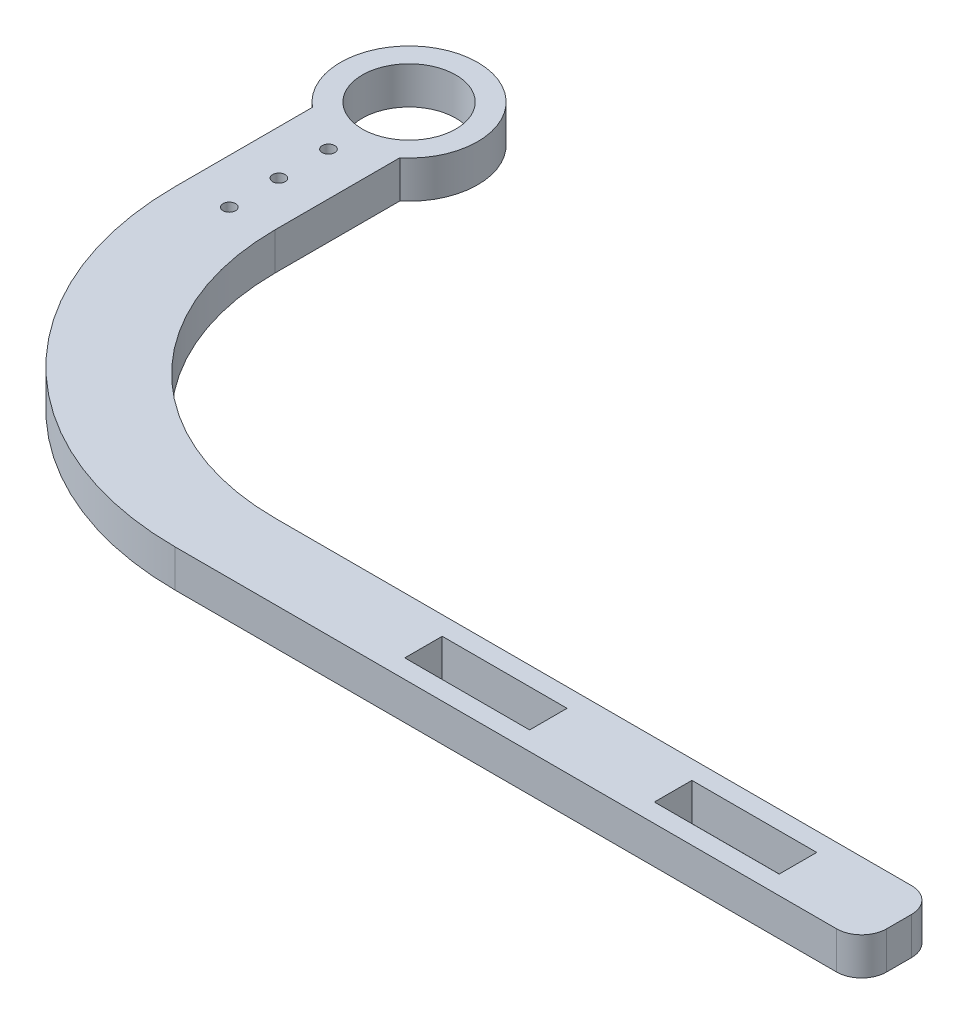
ISO-10303-21;
HEADER;
FILE_DESCRIPTION(('STEP AP214'),'2;1');
FILE_NAME('part.step','',(''),(''),'','','');
FILE_SCHEMA(('AUTOMOTIVE_DESIGN { 1 0 10303 214 1 1 1 1 }'));
ENDSEC;
DATA;
#1=APPLICATION_CONTEXT('core data for automotive mechanical design processes');
#2=APPLICATION_PROTOCOL_DEFINITION('international standard','automotive_design',2000,#1);
#3=PRODUCT_CONTEXT('',#1,'mechanical');
#4=PRODUCT('Part','Part','',(#3));
#5=PRODUCT_RELATED_PRODUCT_CATEGORY('part','',(#4));
#6=PRODUCT_DEFINITION_FORMATION('','',#4);
#7=PRODUCT_DEFINITION_CONTEXT('part definition',#1,'design');
#8=PRODUCT_DEFINITION('design','',#6,#7);
#9=PRODUCT_DEFINITION_SHAPE('','',#8);
#10=(LENGTH_UNIT() NAMED_UNIT(*) SI_UNIT(.MILLI.,.METRE.));
#11=(NAMED_UNIT(*) PLANE_ANGLE_UNIT() SI_UNIT($,.RADIAN.));
#12=(NAMED_UNIT(*) SI_UNIT($,.STERADIAN.) SOLID_ANGLE_UNIT());
#13=UNCERTAINTY_MEASURE_WITH_UNIT(LENGTH_MEASURE(1.E-05),#10,'distance_accuracy_value','');
#14=(GEOMETRIC_REPRESENTATION_CONTEXT(3) GLOBAL_UNCERTAINTY_ASSIGNED_CONTEXT((#13)) GLOBAL_UNIT_ASSIGNED_CONTEXT((#10,
#11,#12)) REPRESENTATION_CONTEXT('',''));
#15=CARTESIAN_POINT('',(0.,0.,0.));
#16=DIRECTION('',(0.,0.,1.));
#17=DIRECTION('',(1.,0.,0.));
#18=AXIS2_PLACEMENT_3D('',#15,#16,#17);
#19=CARTESIAN_POINT('',(0.,0.,0.));
#20=DIRECTION('',(0.,1.,0.));
#21=DIRECTION('',(0.,0.,1.));
#22=AXIS2_PLACEMENT_3D('',#19,#20,#21);
#23=PLANE('',#22);
#24=CARTESIAN_POINT('',(-44.3265920130775,0.,-17.8330576571376));
#25=DIRECTION('',(0.,1.,0.));
#26=DIRECTION('',(0.,0.,1.));
#27=AXIS2_PLACEMENT_3D('',#24,#25,#26);
#28=CIRCLE('',#27,3.75);
#29=CARTESIAN_POINT('',(-44.3265920130775,0.,-14.0830576571376));
#30=VERTEX_POINT('',#29);
#31=EDGE_CURVE('E357',#30,#30,#28,.T.);
#32=ORIENTED_EDGE('',*,*,#31,.T.);
#33=EDGE_LOOP('',(#32));
#34=FACE_BOUND('',#33,.T.);
#35=CARTESIAN_POINT('',(-44.229651360273,0.,-3.33338171214295));
#36=DIRECTION('',(0.,1.,0.));
#37=DIRECTION('',(0.,0.,1.));
#38=AXIS2_PLACEMENT_3D('',#35,#36,#37);
#39=CIRCLE('',#38,0.499999999999999);
#40=CARTESIAN_POINT('',(-44.229651360273,0.,-2.83338171214295));
#41=VERTEX_POINT('',#40);
#42=EDGE_CURVE('E353',#41,#41,#39,.T.);
#43=ORIENTED_EDGE('',*,*,#42,.T.);
#44=EDGE_LOOP('',(#43));
#45=FACE_BOUND('',#44,.T.);
#46=CARTESIAN_POINT('',(-44.2563936093225,0.,-7.3332923176585));
#47=DIRECTION('',(0.,1.,0.));
#48=DIRECTION('',(0.,0.,1.));
#49=AXIS2_PLACEMENT_3D('',#46,#47,#48);
#50=CIRCLE('',#49,0.499999999999999);
#51=CARTESIAN_POINT('',(-44.2563936093225,0.,-6.83329231765851));
#52=VERTEX_POINT('',#51);
#53=EDGE_CURVE('E349',#52,#52,#50,.T.);
#54=ORIENTED_EDGE('',*,*,#53,.T.);
#55=EDGE_LOOP('',(#54));
#56=FACE_BOUND('',#55,.T.);
#57=CARTESIAN_POINT('',(-44.283135858372,0.,-11.3332029231741));
#58=DIRECTION('',(0.,1.,0.));
#59=DIRECTION('',(0.,0.,1.));
#60=AXIS2_PLACEMENT_3D('',#57,#58,#59);
#61=CIRCLE('',#60,0.499999999999999);
#62=CARTESIAN_POINT('',(-44.283135858372,0.,-10.8332029231741));
#63=VERTEX_POINT('',#62);
#64=EDGE_CURVE('E341',#63,#63,#61,.T.);
#65=ORIENTED_EDGE('',*,*,#64,.T.);
#66=EDGE_LOOP('',(#65));
#67=FACE_BOUND('',#66,.T.);
#68=DIRECTION('',(1.,0.,0.));
#69=VECTOR('',#68,1.);
#70=CARTESIAN_POINT('',(0.,0.,17.909583029983));
#71=LINE('',#70,#69);
#72=CARTESIAN_POINT('',(-5.92659201307754,0.,17.909583029983));
#73=VERTEX_POINT('',#72);
#74=CARTESIAN_POINT('',(4.07340798692246,0.,17.909583029983));
#75=VERTEX_POINT('',#74);
#76=EDGE_CURVE('E459',#73,#75,#71,.T.);
#77=ORIENTED_EDGE('',*,*,#76,.F.);
#78=DIRECTION('',(0.,0.,-1.));
#79=VECTOR('',#78,1.);
#80=CARTESIAN_POINT('',(-5.92659201307754,0.,0.));
#81=LINE('',#80,#79);
#82=CARTESIAN_POINT('',(-5.92659201307754,0.,20.909583029983));
#83=VERTEX_POINT('',#82);
#84=EDGE_CURVE('E450',#83,#73,#81,.T.);
#85=ORIENTED_EDGE('',*,*,#84,.F.);
#86=DIRECTION('',(1.,0.,0.));
#87=VECTOR('',#86,1.);
#88=CARTESIAN_POINT('',(0.,0.,20.909583029983));
#89=LINE('',#88,#87);
#90=CARTESIAN_POINT('',(4.07340798692246,0.,20.909583029983));
#91=VERTEX_POINT('',#90);
#92=EDGE_CURVE('E225',#83,#91,#89,.T.);
#93=ORIENTED_EDGE('',*,*,#92,.T.);
#94=DIRECTION('',(0.,0.,-1.));
#95=VECTOR('',#94,1.);
#96=CARTESIAN_POINT('',(4.07340798692246,0.,0.));
#97=LINE('',#96,#95);
#98=EDGE_CURVE('E455',#91,#75,#97,.T.);
#99=ORIENTED_EDGE('',*,*,#98,.T.);
#100=EDGE_LOOP('',(#77,#85,#93,#99));
#101=FACE_BOUND('',#100,.T.);
#102=DIRECTION('',(0.,0.,1.));
#103=VECTOR('',#102,1.);
#104=CARTESIAN_POINT('',(32.1734079869225,0.,0.));
#105=LINE('',#104,#103);
#106=CARTESIAN_POINT('',(32.1734079869225,0.,18.409583029983));
#107=VERTEX_POINT('',#106);
#108=CARTESIAN_POINT('',(32.1734079869225,0.,20.409583029983));
#109=VERTEX_POINT('',#108);
#110=EDGE_CURVE('E435',#107,#109,#105,.T.);
#111=ORIENTED_EDGE('',*,*,#110,.T.);
#112=CARTESIAN_POINT('',(30.1734079869225,0.,20.409583029983));
#113=DIRECTION('',(0.,1.,0.));
#114=DIRECTION('',(0.,0.,1.));
#115=AXIS2_PLACEMENT_3D('',#112,#113,#114);
#116=CIRCLE('',#115,2.);
#117=CARTESIAN_POINT('',(30.1734079869225,0.,22.409583029983));
#118=VERTEX_POINT('',#117);
#119=EDGE_CURVE('E98',#109,#118,#116,.F.);
#120=ORIENTED_EDGE('',*,*,#119,.T.);
#121=DIRECTION('',(-1.,0.,0.));
#122=VECTOR('',#121,1.);
#123=CARTESIAN_POINT('',(0.,0.,22.409583029983));
#124=LINE('',#123,#122);
#125=CARTESIAN_POINT('',(-22.8265920130775,0.,22.409583029983));
#126=VERTEX_POINT('',#125);
#127=EDGE_CURVE('E418',#118,#126,#124,.T.);
#128=ORIENTED_EDGE('',*,*,#127,.T.);
#129=CARTESIAN_POINT('',(-22.8265920130775,0.,-2.59041697001697));
#130=DIRECTION('',(0.,1.,0.));
#131=DIRECTION('',(0.,0.,1.));
#132=AXIS2_PLACEMENT_3D('',#129,#130,#131);
#133=CIRCLE('',#132,25.);
#134=CARTESIAN_POINT('',(-47.8265920130775,0.,-2.59041697001697));
#135=VERTEX_POINT('',#134);
#136=EDGE_CURVE('E294',#126,#135,#133,.F.);
#137=ORIENTED_EDGE('',*,*,#136,.T.);
#138=DIRECTION('',(0.,0.,-1.));
#139=VECTOR('',#138,1.);
#140=CARTESIAN_POINT('',(-47.8265920130775,0.,0.));
#141=LINE('',#140,#139);
#142=CARTESIAN_POINT('',(-47.8265920130775,0.,-13.590416970017));
#143=VERTEX_POINT('',#142);
#144=EDGE_CURVE('E442',#135,#143,#141,.T.);
#145=ORIENTED_EDGE('',*,*,#144,.T.);
#146=CARTESIAN_POINT('',(-44.3265920130775,0.,-17.8330576571363));
#147=DIRECTION('',(0.,1.,0.));
#148=DIRECTION('',(0.,0.,1.));
#149=AXIS2_PLACEMENT_3D('',#146,#147,#148);
#150=CIRCLE('',#149,5.5);
#151=CARTESIAN_POINT('',(-40.8265920130775,0.,-13.590416970017));
#152=VERTEX_POINT('',#151);
#153=EDGE_CURVE('E543',#143,#152,#150,.F.);
#154=ORIENTED_EDGE('',*,*,#153,.T.);
#155=DIRECTION('',(0.,0.,1.));
#156=VECTOR('',#155,1.);
#157=CARTESIAN_POINT('',(-40.8265920130775,0.,0.));
#158=LINE('',#157,#156);
#159=CARTESIAN_POINT('',(-40.8265920130775,0.,-3.59041697001697));
#160=VERTEX_POINT('',#159);
#161=EDGE_CURVE('E444',#152,#160,#158,.T.);
#162=ORIENTED_EDGE('',*,*,#161,.T.);
#163=CARTESIAN_POINT('',(-20.8265920130775,0.,-3.59041697001698));
#164=DIRECTION('',(0.,1.,0.));
#165=DIRECTION('',(0.,0.,1.));
#166=AXIS2_PLACEMENT_3D('',#163,#164,#165);
#167=CIRCLE('',#166,20.);
#168=CARTESIAN_POINT('',(-20.8265920130775,0.,16.409583029983));
#169=VERTEX_POINT('',#168);
#170=EDGE_CURVE('E486',#160,#169,#167,.T.);
#171=ORIENTED_EDGE('',*,*,#170,.T.);
#172=DIRECTION('',(1.,0.,0.));
#173=VECTOR('',#172,1.);
#174=CARTESIAN_POINT('',(0.,0.,16.409583029983));
#175=LINE('',#174,#173);
#176=CARTESIAN_POINT('',(30.1734079869225,0.,16.409583029983));
#177=VERTEX_POINT('',#176);
#178=EDGE_CURVE('E438',#169,#177,#175,.T.);
#179=ORIENTED_EDGE('',*,*,#178,.T.);
#180=CARTESIAN_POINT('',(30.1734079869225,0.,18.409583029983));
#181=DIRECTION('',(0.,1.,0.));
#182=DIRECTION('',(0.,0.,1.));
#183=AXIS2_PLACEMENT_3D('',#180,#181,#182);
#184=CIRCLE('',#183,2.);
#185=EDGE_CURVE('E428',#177,#107,#184,.F.);
#186=ORIENTED_EDGE('',*,*,#185,.T.);
#187=EDGE_LOOP('',(#111,#120,#128,#137,#145,#154,#162,#171,#179,#186));
#188=FACE_BOUND('',#187,.T.);
#189=DIRECTION('',(0.,0.,1.));
#190=VECTOR('',#189,1.);
#191=CARTESIAN_POINT('',(14.0734079869224,0.,0.));
#192=LINE('',#191,#190);
#193=CARTESIAN_POINT('',(14.0734079869225,0.,17.9065216568602));
#194=VERTEX_POINT('',#193);
#195=CARTESIAN_POINT('',(14.0734079869225,0.,20.9126444031059));
#196=VERTEX_POINT('',#195);
#197=EDGE_CURVE('E469',#194,#196,#192,.T.);
#198=ORIENTED_EDGE('',*,*,#197,.T.);
#199=DIRECTION('',(1.,0.,0.));
#200=VECTOR('',#199,1.);
#201=CARTESIAN_POINT('',(0.,0.,20.9126444031059));
#202=LINE('',#201,#200);
#203=CARTESIAN_POINT('',(24.0734079869225,0.,20.9126444031059));
#204=VERTEX_POINT('',#203);
#205=EDGE_CURVE('E473',#196,#204,#202,.T.);
#206=ORIENTED_EDGE('',*,*,#205,.T.);
#207=DIRECTION('',(0.,0.,1.));
#208=VECTOR('',#207,1.);
#209=CARTESIAN_POINT('',(24.0734079869225,0.,0.));
#210=LINE('',#209,#208);
#211=CARTESIAN_POINT('',(24.0734079869225,0.,17.9065216568602));
#212=VERTEX_POINT('',#211);
#213=EDGE_CURVE('E462',#212,#204,#210,.T.);
#214=ORIENTED_EDGE('',*,*,#213,.F.);
#215=DIRECTION('',(1.,0.,0.));
#216=VECTOR('',#215,1.);
#217=CARTESIAN_POINT('',(0.,0.,17.9065216568602));
#218=LINE('',#217,#216);
#219=EDGE_CURVE('E465',#194,#212,#218,.T.);
#220=ORIENTED_EDGE('',*,*,#219,.F.);
#221=EDGE_LOOP('',(#198,#206,#214,#220));
#222=FACE_BOUND('',#221,.T.);
#223=ADVANCED_FACE('F89',(#34,#45,#56,#67,#101,#188,#222),#23,.F.);
#224=CARTESIAN_POINT('',(-47.8265920130775,-7.,0.));
#225=DIRECTION('',(1.,0.,0.));
#226=DIRECTION('',(0.,0.,-1.));
#227=AXIS2_PLACEMENT_3D('',#224,#225,#226);
#228=PLANE('',#227);
#229=ORIENTED_EDGE('',*,*,#144,.F.);
#230=DIRECTION('',(0.,1.,0.));
#231=VECTOR('',#230,1.);
#232=CARTESIAN_POINT('',(-47.8265920130775,-7.,-2.59041697001697));
#233=LINE('',#232,#231);
#234=CARTESIAN_POINT('',(-47.8265920130775,3.,-2.59041697001697));
#235=VERTEX_POINT('',#234);
#236=EDGE_CURVE('E289',#135,#235,#233,.T.);
#237=ORIENTED_EDGE('',*,*,#236,.T.);
#238=DIRECTION('',(0.,0.,-1.));
#239=VECTOR('',#238,1.);
#240=CARTESIAN_POINT('',(-47.8265920130775,3.,0.));
#241=LINE('',#240,#239);
#242=CARTESIAN_POINT('',(-47.8265920130775,3.,-13.590416970017));
#243=VERTEX_POINT('',#242);
#244=EDGE_CURVE('E270',#235,#243,#241,.T.);
#245=ORIENTED_EDGE('',*,*,#244,.T.);
#246=DIRECTION('',(0.,1.,0.));
#247=VECTOR('',#246,1.);
#248=CARTESIAN_POINT('',(-47.8265920130775,-7.,-13.590416970017));
#249=LINE('',#248,#247);
#250=EDGE_CURVE('E326',#143,#243,#249,.T.);
#251=ORIENTED_EDGE('',*,*,#250,.F.);
#252=EDGE_LOOP('',(#229,#237,#245,#251));
#253=FACE_BOUND('',#252,.T.);
#254=ADVANCED_FACE('F495',(#253),#228,.F.);
#255=CARTESIAN_POINT('',(0.,-7.,22.409583029983));
#256=DIRECTION('',(0.,0.,-1.));
#257=DIRECTION('',(-1.,0.,0.));
#258=AXIS2_PLACEMENT_3D('',#255,#256,#257);
#259=PLANE('',#258);
#260=ORIENTED_EDGE('',*,*,#127,.F.);
#261=DIRECTION('',(0.,1.,0.));
#262=VECTOR('',#261,1.);
#263=CARTESIAN_POINT('',(30.1734079869225,-7.,22.409583029983));
#264=LINE('',#263,#262);
#265=CARTESIAN_POINT('',(30.1734079869225,3.,22.409583029983));
#266=VERTEX_POINT('',#265);
#267=EDGE_CURVE('E297',#118,#266,#264,.T.);
#268=ORIENTED_EDGE('',*,*,#267,.T.);
#269=DIRECTION('',(-1.,0.,0.));
#270=VECTOR('',#269,1.);
#271=CARTESIAN_POINT('',(0.,3.,22.409583029983));
#272=LINE('',#271,#270);
#273=CARTESIAN_POINT('',(-22.8265920130775,3.,22.409583029983));
#274=VERTEX_POINT('',#273);
#275=EDGE_CURVE('E322',#266,#274,#272,.T.);
#276=ORIENTED_EDGE('',*,*,#275,.T.);
#277=DIRECTION('',(0.,1.,0.));
#278=VECTOR('',#277,1.);
#279=CARTESIAN_POINT('',(-22.8265920130775,-7.,22.409583029983));
#280=LINE('',#279,#278);
#281=EDGE_CURVE('E288',#274,#126,#280,.F.);
#282=ORIENTED_EDGE('',*,*,#281,.T.);
#283=EDGE_LOOP('',(#260,#268,#276,#282));
#284=FACE_BOUND('',#283,.T.);
#285=ADVANCED_FACE('F415',(#284),#259,.F.);
#286=CARTESIAN_POINT('',(32.1734079869225,-7.,0.));
#287=DIRECTION('',(-1.,0.,0.));
#288=DIRECTION('',(0.,0.,1.));
#289=AXIS2_PLACEMENT_3D('',#286,#287,#288);
#290=PLANE('',#289);
#291=DIRECTION('',(0.,0.,1.));
#292=VECTOR('',#291,1.);
#293=CARTESIAN_POINT('',(32.1734079869225,3.,0.));
#294=LINE('',#293,#292);
#295=CARTESIAN_POINT('',(32.1734079869225,3.,18.409583029983));
#296=VERTEX_POINT('',#295);
#297=CARTESIAN_POINT('',(32.1734079869225,3.,20.409583029983));
#298=VERTEX_POINT('',#297);
#299=EDGE_CURVE('E316',#296,#298,#294,.T.);
#300=ORIENTED_EDGE('',*,*,#299,.T.);
#301=DIRECTION('',(0.,1.,0.));
#302=VECTOR('',#301,1.);
#303=CARTESIAN_POINT('',(32.1734079869225,-7.,20.409583029983));
#304=LINE('',#303,#302);
#305=EDGE_CURVE('E111',#298,#109,#304,.F.);
#306=ORIENTED_EDGE('',*,*,#305,.T.);
#307=ORIENTED_EDGE('',*,*,#110,.F.);
#308=DIRECTION('',(0.,1.,0.));
#309=VECTOR('',#308,1.);
#310=CARTESIAN_POINT('',(32.1734079869225,-7.,18.409583029983));
#311=LINE('',#310,#309);
#312=EDGE_CURVE('E423',#107,#296,#311,.T.);
#313=ORIENTED_EDGE('',*,*,#312,.T.);
#314=EDGE_LOOP('',(#300,#306,#307,#313));
#315=FACE_BOUND('',#314,.T.);
#316=ADVANCED_FACE('F564',(#315),#290,.F.);
#317=CARTESIAN_POINT('',(0.,-7.,16.409583029983));
#318=DIRECTION('',(0.,0.,1.));
#319=DIRECTION('',(1.,0.,0.));
#320=AXIS2_PLACEMENT_3D('',#317,#318,#319);
#321=PLANE('',#320);
#322=DIRECTION('',(1.,0.,0.));
#323=VECTOR('',#322,1.);
#324=CARTESIAN_POINT('',(0.,3.,16.409583029983));
#325=LINE('',#324,#323);
#326=CARTESIAN_POINT('',(-20.8265920130775,3.,16.409583029983));
#327=VERTEX_POINT('',#326);
#328=CARTESIAN_POINT('',(30.1734079869225,3.,16.409583029983));
#329=VERTEX_POINT('',#328);
#330=EDGE_CURVE('E313',#327,#329,#325,.T.);
#331=ORIENTED_EDGE('',*,*,#330,.T.);
#332=DIRECTION('',(0.,1.,0.));
#333=VECTOR('',#332,1.);
#334=CARTESIAN_POINT('',(30.1734079869225,-7.,16.409583029983));
#335=LINE('',#334,#333);
#336=EDGE_CURVE('E13',#329,#177,#335,.F.);
#337=ORIENTED_EDGE('',*,*,#336,.T.);
#338=ORIENTED_EDGE('',*,*,#178,.F.);
#339=DIRECTION('',(0.,1.,0.));
#340=VECTOR('',#339,1.);
#341=CARTESIAN_POINT('',(-20.8265920130775,3.,16.409583029983));
#342=LINE('',#341,#340);
#343=EDGE_CURVE('E477',#169,#327,#342,.T.);
#344=ORIENTED_EDGE('',*,*,#343,.T.);
#345=EDGE_LOOP('',(#331,#337,#338,#344));
#346=FACE_BOUND('',#345,.T.);
#347=ADVANCED_FACE('F513',(#346),#321,.F.);
#348=CARTESIAN_POINT('',(-40.8265920130775,-7.,0.));
#349=DIRECTION('',(-1.,0.,0.));
#350=DIRECTION('',(0.,0.,1.));
#351=AXIS2_PLACEMENT_3D('',#348,#349,#350);
#352=PLANE('',#351);
#353=DIRECTION('',(0.,0.,1.));
#354=VECTOR('',#353,1.);
#355=CARTESIAN_POINT('',(-40.8265920130775,3.,0.));
#356=LINE('',#355,#354);
#357=CARTESIAN_POINT('',(-40.8265920130775,3.,-13.590416970017));
#358=VERTEX_POINT('',#357);
#359=CARTESIAN_POINT('',(-40.8265920130775,3.,-3.59041697001697));
#360=VERTEX_POINT('',#359);
#361=EDGE_CURVE('E317',#358,#360,#356,.T.);
#362=ORIENTED_EDGE('',*,*,#361,.T.);
#363=DIRECTION('',(0.,1.,0.));
#364=VECTOR('',#363,1.);
#365=CARTESIAN_POINT('',(-40.8265920130775,0.,-3.59041697001697));
#366=LINE('',#365,#364);
#367=EDGE_CURVE('E481',#360,#160,#366,.F.);
#368=ORIENTED_EDGE('',*,*,#367,.T.);
#369=ORIENTED_EDGE('',*,*,#161,.F.);
#370=DIRECTION('',(0.,1.,0.));
#371=VECTOR('',#370,1.);
#372=CARTESIAN_POINT('',(-40.8265920130775,-7.,-13.590416970017));
#373=LINE('',#372,#371);
#374=EDGE_CURVE('E327',#152,#358,#373,.T.);
#375=ORIENTED_EDGE('',*,*,#374,.T.);
#376=EDGE_LOOP('',(#362,#368,#369,#375));
#377=FACE_BOUND('',#376,.T.);
#378=ADVANCED_FACE('F508',(#377),#352,.F.);
#379=CARTESIAN_POINT('',(-44.3265920130775,-7.,-17.8330576571363));
#380=DIRECTION('',(0.,1.,0.));
#381=DIRECTION('',(0.,0.,1.));
#382=AXIS2_PLACEMENT_3D('',#379,#380,#381);
#383=CYLINDRICAL_SURFACE('',#382,5.5);
#384=ORIENTED_EDGE('',*,*,#250,.T.);
#385=CARTESIAN_POINT('',(-44.3265920130775,3.,-17.8330576571363));
#386=DIRECTION('',(0.,1.,0.));
#387=DIRECTION('',(0.,0.,1.));
#388=AXIS2_PLACEMENT_3D('',#385,#386,#387);
#389=CIRCLE('',#388,5.5);
#390=EDGE_CURVE('E274',#243,#358,#389,.F.);
#391=ORIENTED_EDGE('',*,*,#390,.T.);
#392=ORIENTED_EDGE('',*,*,#374,.F.);
#393=ORIENTED_EDGE('',*,*,#153,.F.);
#394=EDGE_LOOP('',(#384,#391,#392,#393));
#395=FACE_BOUND('',#394,.T.);
#396=ADVANCED_FACE('F544',(#395),#383,.T.);
#397=CARTESIAN_POINT('',(-5.92659201307754,-7.,17.909583029983));
#398=DIRECTION('',(0.,0.,1.));
#399=DIRECTION('',(1.,0.,0.));
#400=AXIS2_PLACEMENT_3D('',#397,#398,#399);
#401=PLANE('',#400);
#402=ORIENTED_EDGE('',*,*,#76,.T.);
#403=DIRECTION('',(0.,1.,0.));
#404=VECTOR('',#403,1.);
#405=CARTESIAN_POINT('',(4.07340798692246,-7.,17.909583029983));
#406=LINE('',#405,#404);
#407=CARTESIAN_POINT('',(4.07340798692246,3.,17.909583029983));
#408=VERTEX_POINT('',#407);
#409=EDGE_CURVE('E266',#75,#408,#406,.T.);
#410=ORIENTED_EDGE('',*,*,#409,.T.);
#411=DIRECTION('',(1.,0.,0.));
#412=VECTOR('',#411,1.);
#413=CARTESIAN_POINT('',(-5.92659201307754,3.,17.909583029983));
#414=LINE('',#413,#412);
#415=CARTESIAN_POINT('',(-5.92659201307754,3.,17.909583029983));
#416=VERTEX_POINT('',#415);
#417=EDGE_CURVE('E248',#416,#408,#414,.T.);
#418=ORIENTED_EDGE('',*,*,#417,.F.);
#419=DIRECTION('',(0.,1.,0.));
#420=VECTOR('',#419,1.);
#421=CARTESIAN_POINT('',(-5.92659201307754,-7.,17.909583029983));
#422=LINE('',#421,#420);
#423=EDGE_CURVE('E229',#73,#416,#422,.T.);
#424=ORIENTED_EDGE('',*,*,#423,.F.);
#425=EDGE_LOOP('',(#402,#410,#418,#424));
#426=FACE_BOUND('',#425,.T.);
#427=ADVANCED_FACE('F551',(#426),#401,.T.);
#428=CARTESIAN_POINT('',(4.07340798692246,-7.,20.909583029983));
#429=DIRECTION('',(1.,0.,0.));
#430=DIRECTION('',(0.,0.,-1.));
#431=AXIS2_PLACEMENT_3D('',#428,#429,#430);
#432=PLANE('',#431);
#433=DIRECTION('',(0.,1.,0.));
#434=VECTOR('',#433,1.);
#435=CARTESIAN_POINT('',(4.07340798692246,-7.,20.909583029983));
#436=LINE('',#435,#434);
#437=CARTESIAN_POINT('',(4.07340798692246,3.,20.909583029983));
#438=VERTEX_POINT('',#437);
#439=EDGE_CURVE('E230',#91,#438,#436,.T.);
#440=ORIENTED_EDGE('',*,*,#439,.T.);
#441=DIRECTION('',(0.,0.,-1.));
#442=VECTOR('',#441,1.);
#443=CARTESIAN_POINT('',(4.07340798692246,3.,20.909583029983));
#444=LINE('',#443,#442);
#445=EDGE_CURVE('E244',#438,#408,#444,.T.);
#446=ORIENTED_EDGE('',*,*,#445,.T.);
#447=ORIENTED_EDGE('',*,*,#409,.F.);
#448=ORIENTED_EDGE('',*,*,#98,.F.);
#449=EDGE_LOOP('',(#440,#446,#447,#448));
#450=FACE_BOUND('',#449,.T.);
#451=ADVANCED_FACE('F557',(#450),#432,.F.);
#452=CARTESIAN_POINT('',(-5.92659201307754,-7.,20.909583029983));
#453=DIRECTION('',(0.,0.,1.));
#454=DIRECTION('',(1.,0.,0.));
#455=AXIS2_PLACEMENT_3D('',#452,#453,#454);
#456=PLANE('',#455);
#457=DIRECTION('',(0.,1.,0.));
#458=VECTOR('',#457,1.);
#459=CARTESIAN_POINT('',(-5.92659201307754,-7.,20.909583029983));
#460=LINE('',#459,#458);
#461=CARTESIAN_POINT('',(-5.92659201307754,3.,20.909583029983));
#462=VERTEX_POINT('',#461);
#463=EDGE_CURVE('E217',#83,#462,#460,.T.);
#464=ORIENTED_EDGE('',*,*,#463,.T.);
#465=DIRECTION('',(1.,0.,0.));
#466=VECTOR('',#465,1.);
#467=CARTESIAN_POINT('',(-5.92659201307754,3.,20.909583029983));
#468=LINE('',#467,#466);
#469=EDGE_CURVE('E222',#462,#438,#468,.T.);
#470=ORIENTED_EDGE('',*,*,#469,.T.);
#471=ORIENTED_EDGE('',*,*,#439,.F.);
#472=ORIENTED_EDGE('',*,*,#92,.F.);
#473=EDGE_LOOP('',(#464,#470,#471,#472));
#474=FACE_BOUND('',#473,.T.);
#475=ADVANCED_FACE('F219',(#474),#456,.F.);
#476=CARTESIAN_POINT('',(-5.92659201307754,-7.,20.909583029983));
#477=DIRECTION('',(1.,0.,0.));
#478=DIRECTION('',(0.,0.,-1.));
#479=AXIS2_PLACEMENT_3D('',#476,#477,#478);
#480=PLANE('',#479);
#481=ORIENTED_EDGE('',*,*,#84,.T.);
#482=ORIENTED_EDGE('',*,*,#423,.T.);
#483=DIRECTION('',(0.,0.,-1.));
#484=VECTOR('',#483,1.);
#485=CARTESIAN_POINT('',(-5.92659201307754,3.,20.909583029983));
#486=LINE('',#485,#484);
#487=EDGE_CURVE('E234',#462,#416,#486,.T.);
#488=ORIENTED_EDGE('',*,*,#487,.F.);
#489=ORIENTED_EDGE('',*,*,#463,.F.);
#490=EDGE_LOOP('',(#481,#482,#488,#489));
#491=FACE_BOUND('',#490,.T.);
#492=ADVANCED_FACE('F235',(#491),#480,.T.);
#493=CARTESIAN_POINT('',(14.0734079869225,-7.,20.9126444031059));
#494=DIRECTION('',(0.,0.,1.));
#495=DIRECTION('',(1.,0.,0.));
#496=AXIS2_PLACEMENT_3D('',#493,#494,#495);
#497=PLANE('',#496);
#498=DIRECTION('',(0.,1.,0.));
#499=VECTOR('',#498,1.);
#500=CARTESIAN_POINT('',(14.0734079869225,-7.,20.9126444031059));
#501=LINE('',#500,#499);
#502=CARTESIAN_POINT('',(14.0734079869225,3.,20.9126444031059));
#503=VERTEX_POINT('',#502);
#504=EDGE_CURVE('E361',#196,#503,#501,.T.);
#505=ORIENTED_EDGE('',*,*,#504,.T.);
#506=DIRECTION('',(1.,0.,0.));
#507=VECTOR('',#506,1.);
#508=CARTESIAN_POINT('',(14.0734079869225,3.,20.9126444031059));
#509=LINE('',#508,#507);
#510=CARTESIAN_POINT('',(24.0734079869225,3.,20.9126444031059));
#511=VERTEX_POINT('',#510);
#512=EDGE_CURVE('E262',#503,#511,#509,.T.);
#513=ORIENTED_EDGE('',*,*,#512,.T.);
#514=DIRECTION('',(0.,1.,0.));
#515=VECTOR('',#514,1.);
#516=CARTESIAN_POINT('',(24.0734079869225,-7.,20.9126444031059));
#517=LINE('',#516,#515);
#518=EDGE_CURVE('E375',#204,#511,#517,.T.);
#519=ORIENTED_EDGE('',*,*,#518,.F.);
#520=ORIENTED_EDGE('',*,*,#205,.F.);
#521=EDGE_LOOP('',(#505,#513,#519,#520));
#522=FACE_BOUND('',#521,.T.);
#523=ADVANCED_FACE('F572',(#522),#497,.F.);
#524=CARTESIAN_POINT('',(14.0734079869225,-7.,17.9065216568602));
#525=DIRECTION('',(-1.,0.,0.));
#526=DIRECTION('',(0.,0.,1.));
#527=AXIS2_PLACEMENT_3D('',#524,#525,#526);
#528=PLANE('',#527);
#529=DIRECTION('',(0.,1.,0.));
#530=VECTOR('',#529,1.);
#531=CARTESIAN_POINT('',(14.0734079869225,-7.,17.9065216568602));
#532=LINE('',#531,#530);
#533=CARTESIAN_POINT('',(14.0734079869225,3.,17.9065216568602));
#534=VERTEX_POINT('',#533);
#535=EDGE_CURVE('E381',#194,#534,#532,.T.);
#536=ORIENTED_EDGE('',*,*,#535,.T.);
#537=DIRECTION('',(0.,0.,1.));
#538=VECTOR('',#537,1.);
#539=CARTESIAN_POINT('',(14.0734079869225,3.,17.9065216568602));
#540=LINE('',#539,#538);
#541=EDGE_CURVE('E372',#534,#503,#540,.T.);
#542=ORIENTED_EDGE('',*,*,#541,.T.);
#543=ORIENTED_EDGE('',*,*,#504,.F.);
#544=ORIENTED_EDGE('',*,*,#197,.F.);
#545=EDGE_LOOP('',(#536,#542,#543,#544));
#546=FACE_BOUND('',#545,.T.);
#547=ADVANCED_FACE('F568',(#546),#528,.F.);
#548=CARTESIAN_POINT('',(14.0734079869225,-7.,17.9065216568602));
#549=DIRECTION('',(0.,0.,1.));
#550=DIRECTION('',(1.,0.,0.));
#551=AXIS2_PLACEMENT_3D('',#548,#549,#550);
#552=PLANE('',#551);
#553=ORIENTED_EDGE('',*,*,#219,.T.);
#554=DIRECTION('',(0.,1.,0.));
#555=VECTOR('',#554,1.);
#556=CARTESIAN_POINT('',(24.0734079869225,-7.,17.9065216568602));
#557=LINE('',#556,#555);
#558=CARTESIAN_POINT('',(24.0734079869225,3.,17.9065216568602));
#559=VERTEX_POINT('',#558);
#560=EDGE_CURVE('E378',#212,#559,#557,.T.);
#561=ORIENTED_EDGE('',*,*,#560,.T.);
#562=DIRECTION('',(1.,0.,0.));
#563=VECTOR('',#562,1.);
#564=CARTESIAN_POINT('',(14.0734079869225,3.,17.9065216568602));
#565=LINE('',#564,#563);
#566=EDGE_CURVE('E369',#534,#559,#565,.T.);
#567=ORIENTED_EDGE('',*,*,#566,.F.);
#568=ORIENTED_EDGE('',*,*,#535,.F.);
#569=EDGE_LOOP('',(#553,#561,#567,#568));
#570=FACE_BOUND('',#569,.T.);
#571=ADVANCED_FACE('F571',(#570),#552,.T.);
#572=CARTESIAN_POINT('',(24.0734079869225,-7.,17.9065216568602));
#573=DIRECTION('',(-1.,0.,0.));
#574=DIRECTION('',(0.,0.,1.));
#575=AXIS2_PLACEMENT_3D('',#572,#573,#574);
#576=PLANE('',#575);
#577=ORIENTED_EDGE('',*,*,#213,.T.);
#578=ORIENTED_EDGE('',*,*,#518,.T.);
#579=DIRECTION('',(0.,0.,1.));
#580=VECTOR('',#579,1.);
#581=CARTESIAN_POINT('',(24.0734079869225,3.,17.9065216568602));
#582=LINE('',#581,#580);
#583=EDGE_CURVE('E267',#559,#511,#582,.T.);
#584=ORIENTED_EDGE('',*,*,#583,.F.);
#585=ORIENTED_EDGE('',*,*,#560,.F.);
#586=EDGE_LOOP('',(#577,#578,#584,#585));
#587=FACE_BOUND('',#586,.T.);
#588=ADVANCED_FACE('F401',(#587),#576,.T.);
#589=CARTESIAN_POINT('',(0.,3.,0.));
#590=DIRECTION('',(0.,1.,0.));
#591=DIRECTION('',(0.,0.,1.));
#592=AXIS2_PLACEMENT_3D('',#589,#590,#591);
#593=PLANE('',#592);
#594=CARTESIAN_POINT('',(-44.3265920130775,3.,-17.8330576571376));
#595=DIRECTION('',(0.,1.,0.));
#596=DIRECTION('',(0.,0.,1.));
#597=AXIS2_PLACEMENT_3D('',#594,#595,#596);
#598=CIRCLE('',#597,3.75);
#599=CARTESIAN_POINT('',(-44.3265920130775,3.,-14.0830576571376));
#600=VERTEX_POINT('',#599);
#601=EDGE_CURVE('E343',#600,#600,#598,.T.);
#602=ORIENTED_EDGE('',*,*,#601,.F.);
#603=EDGE_LOOP('',(#602));
#604=FACE_BOUND('',#603,.T.);
#605=CARTESIAN_POINT('',(-44.229651360273,3.,-3.33338171214295));
#606=DIRECTION('',(0.,1.,0.));
#607=DIRECTION('',(0.,0.,1.));
#608=AXIS2_PLACEMENT_3D('',#605,#606,#607);
#609=CIRCLE('',#608,0.499999999999999);
#610=CARTESIAN_POINT('',(-44.229651360273,3.,-2.83338171214295));
#611=VERTEX_POINT('',#610);
#612=EDGE_CURVE('E389',#611,#611,#609,.T.);
#613=ORIENTED_EDGE('',*,*,#612,.F.);
#614=EDGE_LOOP('',(#613));
#615=FACE_BOUND('',#614,.T.);
#616=CARTESIAN_POINT('',(-44.2563936093225,3.,-7.3332923176585));
#617=DIRECTION('',(0.,1.,0.));
#618=DIRECTION('',(0.,0.,1.));
#619=AXIS2_PLACEMENT_3D('',#616,#617,#618);
#620=CIRCLE('',#619,0.499999999999999);
#621=CARTESIAN_POINT('',(-44.2563936093225,3.,-6.83329231765851));
#622=VERTEX_POINT('',#621);
#623=EDGE_CURVE('E342',#622,#622,#620,.T.);
#624=ORIENTED_EDGE('',*,*,#623,.F.);
#625=EDGE_LOOP('',(#624));
#626=FACE_BOUND('',#625,.T.);
#627=CARTESIAN_POINT('',(-44.283135858372,3.,-11.3332029231741));
#628=DIRECTION('',(0.,1.,0.));
#629=DIRECTION('',(0.,0.,1.));
#630=AXIS2_PLACEMENT_3D('',#627,#628,#629);
#631=CIRCLE('',#630,0.499999999999999);
#632=CARTESIAN_POINT('',(-44.283135858372,3.,-10.8332029231741));
#633=VERTEX_POINT('',#632);
#634=EDGE_CURVE('E335',#633,#633,#631,.T.);
#635=ORIENTED_EDGE('',*,*,#634,.F.);
#636=EDGE_LOOP('',(#635));
#637=FACE_BOUND('',#636,.T.);
#638=ORIENTED_EDGE('',*,*,#275,.F.);
#639=CARTESIAN_POINT('',(30.1734079869225,3.,20.409583029983));
#640=DIRECTION('',(0.,1.,0.));
#641=DIRECTION('',(0.,0.,1.));
#642=AXIS2_PLACEMENT_3D('',#639,#640,#641);
#643=CIRCLE('',#642,2.);
#644=EDGE_CURVE('E305',#266,#298,#643,.T.);
#645=ORIENTED_EDGE('',*,*,#644,.T.);
#646=ORIENTED_EDGE('',*,*,#299,.F.);
#647=CARTESIAN_POINT('',(30.1734079869225,3.,18.409583029983));
#648=DIRECTION('',(0.,1.,0.));
#649=DIRECTION('',(0.,0.,1.));
#650=AXIS2_PLACEMENT_3D('',#647,#648,#649);
#651=CIRCLE('',#650,2.);
#652=EDGE_CURVE('E301',#296,#329,#651,.T.);
#653=ORIENTED_EDGE('',*,*,#652,.T.);
#654=ORIENTED_EDGE('',*,*,#330,.F.);
#655=CARTESIAN_POINT('',(-20.8265920130775,3.,-3.59041697001698));
#656=DIRECTION('',(0.,1.,0.));
#657=DIRECTION('',(0.,0.,1.));
#658=AXIS2_PLACEMENT_3D('',#655,#656,#657);
#659=CIRCLE('',#658,20.);
#660=EDGE_CURVE('E484',#327,#360,#659,.F.);
#661=ORIENTED_EDGE('',*,*,#660,.T.);
#662=ORIENTED_EDGE('',*,*,#361,.F.);
#663=ORIENTED_EDGE('',*,*,#390,.F.);
#664=ORIENTED_EDGE('',*,*,#244,.F.);
#665=CARTESIAN_POINT('',(-22.8265920130775,3.,-2.59041697001697));
#666=DIRECTION('',(0.,1.,0.));
#667=DIRECTION('',(0.,0.,1.));
#668=AXIS2_PLACEMENT_3D('',#665,#666,#667);
#669=CIRCLE('',#668,25.);
#670=EDGE_CURVE('E282',#235,#274,#669,.T.);
#671=ORIENTED_EDGE('',*,*,#670,.T.);
#672=EDGE_LOOP('',(#638,#645,#646,#653,#654,#661,#662,#663,#664,#671));
#673=FACE_BOUND('',#672,.T.);
#674=ORIENTED_EDGE('',*,*,#487,.T.);
#675=ORIENTED_EDGE('',*,*,#417,.T.);
#676=ORIENTED_EDGE('',*,*,#445,.F.);
#677=ORIENTED_EDGE('',*,*,#469,.F.);
#678=EDGE_LOOP('',(#674,#675,#676,#677));
#679=FACE_BOUND('',#678,.T.);
#680=ORIENTED_EDGE('',*,*,#512,.F.);
#681=ORIENTED_EDGE('',*,*,#541,.F.);
#682=ORIENTED_EDGE('',*,*,#566,.T.);
#683=ORIENTED_EDGE('',*,*,#583,.T.);
#684=EDGE_LOOP('',(#680,#681,#682,#683));
#685=FACE_BOUND('',#684,.T.);
#686=ADVANCED_FACE('F241',(#604,#615,#626,#637,#673,#679,#685),#593,.T.);
#687=CARTESIAN_POINT('',(-20.8265920130775,-7.,-3.59041697001698));
#688=DIRECTION('',(0.,-1.,0.));
#689=DIRECTION('',(0.,0.,-1.));
#690=AXIS2_PLACEMENT_3D('',#687,#688,#689);
#691=CYLINDRICAL_SURFACE('',#690,20.);
#692=ORIENTED_EDGE('',*,*,#170,.F.);
#693=ORIENTED_EDGE('',*,*,#367,.F.);
#694=ORIENTED_EDGE('',*,*,#660,.F.);
#695=ORIENTED_EDGE('',*,*,#343,.F.);
#696=EDGE_LOOP('',(#692,#693,#694,#695));
#697=FACE_BOUND('',#696,.T.);
#698=ADVANCED_FACE('F400',(#697),#691,.F.);
#699=CARTESIAN_POINT('',(-22.8265920130775,-7.,-2.59041697001697));
#700=DIRECTION('',(0.,1.,0.));
#701=DIRECTION('',(0.,0.,1.));
#702=AXIS2_PLACEMENT_3D('',#699,#700,#701);
#703=CYLINDRICAL_SURFACE('',#702,25.);
#704=ORIENTED_EDGE('',*,*,#136,.F.);
#705=ORIENTED_EDGE('',*,*,#281,.F.);
#706=ORIENTED_EDGE('',*,*,#670,.F.);
#707=ORIENTED_EDGE('',*,*,#236,.F.);
#708=EDGE_LOOP('',(#704,#705,#706,#707));
#709=FACE_BOUND('',#708,.T.);
#710=ADVANCED_FACE('F532',(#709),#703,.T.);
#711=CARTESIAN_POINT('',(-44.283135858372,-7.,-11.3332029231741));
#712=DIRECTION('',(0.,1.,0.));
#713=DIRECTION('',(0.,0.,1.));
#714=AXIS2_PLACEMENT_3D('',#711,#712,#713);
#715=CYLINDRICAL_SURFACE('',#714,0.499999999999999);
#716=ORIENTED_EDGE('',*,*,#634,.T.);
#717=EDGE_LOOP('',(#716));
#718=FACE_BOUND('',#717,.T.);
#719=ORIENTED_EDGE('',*,*,#64,.F.);
#720=EDGE_LOOP('',(#719));
#721=FACE_BOUND('',#720,.T.);
#722=ADVANCED_FACE('F534',(#718,#721),#715,.F.);
#723=CARTESIAN_POINT('',(-44.2563936093225,-7.,-7.3332923176585));
#724=DIRECTION('',(0.,1.,0.));
#725=DIRECTION('',(0.,0.,1.));
#726=AXIS2_PLACEMENT_3D('',#723,#724,#725);
#727=CYLINDRICAL_SURFACE('',#726,0.499999999999999);
#728=ORIENTED_EDGE('',*,*,#623,.T.);
#729=EDGE_LOOP('',(#728));
#730=FACE_BOUND('',#729,.T.);
#731=ORIENTED_EDGE('',*,*,#53,.F.);
#732=EDGE_LOOP('',(#731));
#733=FACE_BOUND('',#732,.T.);
#734=ADVANCED_FACE('F538',(#730,#733),#727,.F.);
#735=CARTESIAN_POINT('',(-44.229651360273,-7.,-3.33338171214295));
#736=DIRECTION('',(0.,1.,0.));
#737=DIRECTION('',(0.,0.,1.));
#738=AXIS2_PLACEMENT_3D('',#735,#736,#737);
#739=CYLINDRICAL_SURFACE('',#738,0.499999999999999);
#740=ORIENTED_EDGE('',*,*,#612,.T.);
#741=EDGE_LOOP('',(#740));
#742=FACE_BOUND('',#741,.T.);
#743=ORIENTED_EDGE('',*,*,#42,.F.);
#744=EDGE_LOOP('',(#743));
#745=FACE_BOUND('',#744,.T.);
#746=ADVANCED_FACE('F592',(#742,#745),#739,.F.);
#747=CARTESIAN_POINT('',(-44.3265920130775,-7.,-17.8330576571376));
#748=DIRECTION('',(0.,1.,0.));
#749=DIRECTION('',(0.,0.,1.));
#750=AXIS2_PLACEMENT_3D('',#747,#748,#749);
#751=CYLINDRICAL_SURFACE('',#750,3.75);
#752=ORIENTED_EDGE('',*,*,#601,.T.);
#753=EDGE_LOOP('',(#752));
#754=FACE_BOUND('',#753,.T.);
#755=ORIENTED_EDGE('',*,*,#31,.F.);
#756=EDGE_LOOP('',(#755));
#757=FACE_BOUND('',#756,.T.);
#758=ADVANCED_FACE('F395',(#754,#757),#751,.F.);
#759=CARTESIAN_POINT('',(30.1734079869225,-7.,20.409583029983));
#760=DIRECTION('',(0.,1.,0.));
#761=DIRECTION('',(0.,0.,1.));
#762=AXIS2_PLACEMENT_3D('',#759,#760,#761);
#763=CYLINDRICAL_SURFACE('',#762,2.);
#764=ORIENTED_EDGE('',*,*,#119,.F.);
#765=ORIENTED_EDGE('',*,*,#305,.F.);
#766=ORIENTED_EDGE('',*,*,#644,.F.);
#767=ORIENTED_EDGE('',*,*,#267,.F.);
#768=EDGE_LOOP('',(#764,#765,#766,#767));
#769=FACE_BOUND('',#768,.T.);
#770=ADVANCED_FACE('F421',(#769),#763,.T.);
#771=CARTESIAN_POINT('',(30.1734079869225,-7.,18.409583029983));
#772=DIRECTION('',(0.,1.,0.));
#773=DIRECTION('',(0.,0.,1.));
#774=AXIS2_PLACEMENT_3D('',#771,#772,#773);
#775=CYLINDRICAL_SURFACE('',#774,2.);
#776=ORIENTED_EDGE('',*,*,#185,.F.);
#777=ORIENTED_EDGE('',*,*,#336,.F.);
#778=ORIENTED_EDGE('',*,*,#652,.F.);
#779=ORIENTED_EDGE('',*,*,#312,.F.);
#780=EDGE_LOOP('',(#776,#777,#778,#779));
#781=FACE_BOUND('',#780,.T.);
#782=ADVANCED_FACE('F91',(#781),#775,.T.);
#783=CLOSED_SHELL('',(#223,#254,#285,#316,#347,#378,#396,#427,#451,#475,#492,#523,#547,#571,
#588,#686,#698,#710,#722,#734,#746,#758,#770,#782));
#784=MANIFOLD_SOLID_BREP('B2',#783);
#785=ADVANCED_BREP_SHAPE_REPRESENTATION('',(#18,#784),#14);
#786=SHAPE_DEFINITION_REPRESENTATION(#9,#785);
ENDSEC;
END-ISO-10303-21;
